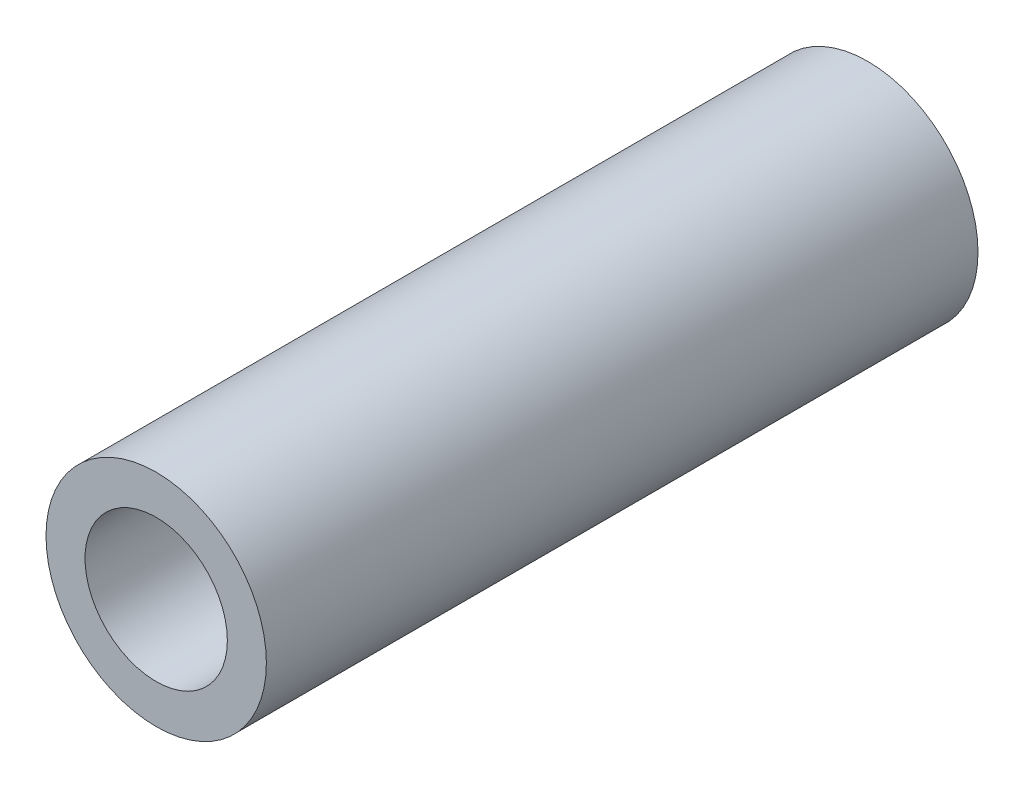
ISO-10303-21;
HEADER;
FILE_DESCRIPTION(('STEP AP214'),'2;1');
FILE_NAME('part.step','',(''),(''),'','','');
FILE_SCHEMA(('AUTOMOTIVE_DESIGN { 1 0 10303 214 1 1 1 1 }'));
ENDSEC;
DATA;
#1=APPLICATION_CONTEXT('core data for automotive mechanical design processes');
#2=APPLICATION_PROTOCOL_DEFINITION('international standard','automotive_design',2000,#1);
#3=PRODUCT_CONTEXT('',#1,'mechanical');
#4=PRODUCT('Part','Part','',(#3));
#5=PRODUCT_RELATED_PRODUCT_CATEGORY('part','',(#4));
#6=PRODUCT_DEFINITION_FORMATION('','',#4);
#7=PRODUCT_DEFINITION_CONTEXT('part definition',#1,'design');
#8=PRODUCT_DEFINITION('design','',#6,#7);
#9=PRODUCT_DEFINITION_SHAPE('','',#8);
#10=(LENGTH_UNIT() NAMED_UNIT(*) SI_UNIT(.MILLI.,.METRE.));
#11=(NAMED_UNIT(*) PLANE_ANGLE_UNIT() SI_UNIT($,.RADIAN.));
#12=(NAMED_UNIT(*) SI_UNIT($,.STERADIAN.) SOLID_ANGLE_UNIT());
#13=UNCERTAINTY_MEASURE_WITH_UNIT(LENGTH_MEASURE(1.E-05),#10,'distance_accuracy_value','');
#14=(GEOMETRIC_REPRESENTATION_CONTEXT(3) GLOBAL_UNCERTAINTY_ASSIGNED_CONTEXT((#13)) GLOBAL_UNIT_ASSIGNED_CONTEXT((#10,
#11,#12)) REPRESENTATION_CONTEXT('',''));
#15=CARTESIAN_POINT('',(0.,0.,0.));
#16=DIRECTION('',(0.,0.,1.));
#17=DIRECTION('',(1.,0.,0.));
#18=AXIS2_PLACEMENT_3D('',#15,#16,#17);
#19=CARTESIAN_POINT('',(0.,0.,15.5));
#20=DIRECTION('',(0.,0.,1.));
#21=DIRECTION('',(1.,0.,0.));
#22=AXIS2_PLACEMENT_3D('',#19,#20,#21);
#23=PLANE('',#22);
#24=CARTESIAN_POINT('',(0.,0.,15.5));
#25=DIRECTION('',(0.,0.,1.));
#26=DIRECTION('',(1.,0.,0.));
#27=AXIS2_PLACEMENT_3D('',#24,#25,#26);
#28=CIRCLE('',#27,2.4);
#29=CARTESIAN_POINT('',(2.4,0.,15.5));
#30=VERTEX_POINT('',#29);
#31=EDGE_CURVE('E10',#30,#30,#28,.T.);
#32=ORIENTED_EDGE('',*,*,#31,.T.);
#33=EDGE_LOOP('',(#32));
#34=FACE_BOUND('',#33,.T.);
#35=CARTESIAN_POINT('',(0.,0.,15.5));
#36=DIRECTION('',(0.,0.,1.));
#37=DIRECTION('',(1.,0.,0.));
#38=AXIS2_PLACEMENT_3D('',#35,#36,#37);
#39=CIRCLE('',#38,1.55);
#40=CARTESIAN_POINT('',(1.55,0.,15.5));
#41=VERTEX_POINT('',#40);
#42=EDGE_CURVE('E42',#41,#41,#39,.T.);
#43=ORIENTED_EDGE('',*,*,#42,.F.);
#44=EDGE_LOOP('',(#43));
#45=FACE_BOUND('',#44,.T.);
#46=ADVANCED_FACE('F31',(#34,#45),#23,.T.);
#47=CARTESIAN_POINT('',(0.,0.,0.));
#48=DIRECTION('',(0.,0.,1.));
#49=DIRECTION('',(1.,0.,0.));
#50=AXIS2_PLACEMENT_3D('',#47,#48,#49);
#51=PLANE('',#50);
#52=CARTESIAN_POINT('',(0.,0.,0.));
#53=DIRECTION('',(0.,0.,1.));
#54=DIRECTION('',(1.,0.,0.));
#55=AXIS2_PLACEMENT_3D('',#52,#53,#54);
#56=CIRCLE('',#55,2.4);
#57=CARTESIAN_POINT('',(2.4,0.,0.));
#58=VERTEX_POINT('',#57);
#59=EDGE_CURVE('E35',#58,#58,#56,.T.);
#60=ORIENTED_EDGE('',*,*,#59,.F.);
#61=EDGE_LOOP('',(#60));
#62=FACE_BOUND('',#61,.T.);
#63=CARTESIAN_POINT('',(0.,0.,0.));
#64=DIRECTION('',(0.,0.,1.));
#65=DIRECTION('',(1.,0.,0.));
#66=AXIS2_PLACEMENT_3D('',#63,#64,#65);
#67=CIRCLE('',#66,1.55);
#68=CARTESIAN_POINT('',(1.55,0.,0.));
#69=VERTEX_POINT('',#68);
#70=EDGE_CURVE('E44',#69,#69,#67,.T.);
#71=ORIENTED_EDGE('',*,*,#70,.T.);
#72=EDGE_LOOP('',(#71));
#73=FACE_BOUND('',#72,.T.);
#74=ADVANCED_FACE('F54',(#62,#73),#51,.F.);
#75=CARTESIAN_POINT('',(0.,0.,15.5));
#76=DIRECTION('',(0.,0.,-1.));
#77=DIRECTION('',(-1.,0.,0.));
#78=AXIS2_PLACEMENT_3D('',#75,#76,#77);
#79=CYLINDRICAL_SURFACE('',#78,2.4);
#80=ORIENTED_EDGE('',*,*,#31,.F.);
#81=EDGE_LOOP('',(#80));
#82=FACE_BOUND('',#81,.T.);
#83=ORIENTED_EDGE('',*,*,#59,.T.);
#84=EDGE_LOOP('',(#83));
#85=FACE_BOUND('',#84,.T.);
#86=ADVANCED_FACE('F33',(#82,#85),#79,.T.);
#87=CARTESIAN_POINT('',(0.,0.,15.5));
#88=DIRECTION('',(0.,0.,-1.));
#89=DIRECTION('',(-1.,0.,0.));
#90=AXIS2_PLACEMENT_3D('',#87,#88,#89);
#91=CYLINDRICAL_SURFACE('',#90,1.55);
#92=ORIENTED_EDGE('',*,*,#42,.T.);
#93=EDGE_LOOP('',(#92));
#94=FACE_BOUND('',#93,.T.);
#95=ORIENTED_EDGE('',*,*,#70,.F.);
#96=EDGE_LOOP('',(#95));
#97=FACE_BOUND('',#96,.T.);
#98=ADVANCED_FACE('F50',(#94,#97),#91,.F.);
#99=CLOSED_SHELL('',(#46,#74,#86,#98));
#100=MANIFOLD_SOLID_BREP('B2',#99);
#101=ADVANCED_BREP_SHAPE_REPRESENTATION('',(#18,#100),#14);
#102=SHAPE_DEFINITION_REPRESENTATION(#9,#101);
ENDSEC;
END-ISO-10303-21;
